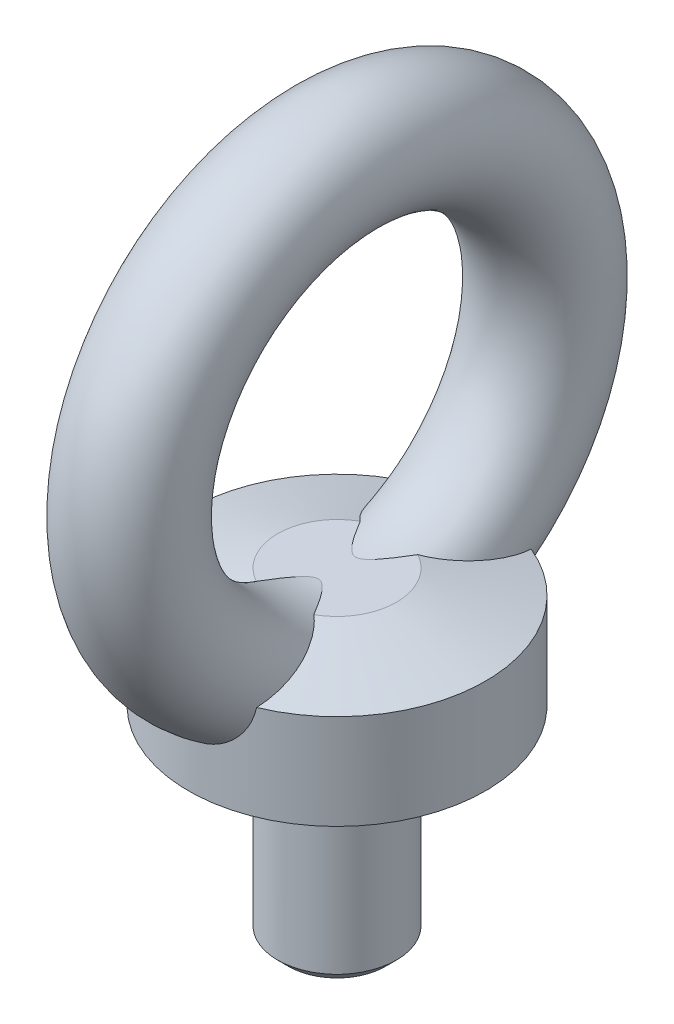
ISO-10303-21;
HEADER;
FILE_DESCRIPTION(('STEP AP214'),'2;1');
FILE_NAME('part.step','',(''),(''),'','','');
FILE_SCHEMA(('AUTOMOTIVE_DESIGN { 1 0 10303 214 1 1 1 1 }'));
ENDSEC;
DATA;
#1=APPLICATION_CONTEXT('core data for automotive mechanical design processes');
#2=APPLICATION_PROTOCOL_DEFINITION('international standard','automotive_design',2000,#1);
#3=PRODUCT_CONTEXT('',#1,'mechanical');
#4=PRODUCT('Part','Part','',(#3));
#5=PRODUCT_RELATED_PRODUCT_CATEGORY('part','',(#4));
#6=PRODUCT_DEFINITION_FORMATION('','',#4);
#7=PRODUCT_DEFINITION_CONTEXT('part definition',#1,'design');
#8=PRODUCT_DEFINITION('design','',#6,#7);
#9=PRODUCT_DEFINITION_SHAPE('','',#8);
#10=(LENGTH_UNIT() NAMED_UNIT(*) SI_UNIT(.MILLI.,.METRE.));
#11=(NAMED_UNIT(*) PLANE_ANGLE_UNIT() SI_UNIT($,.RADIAN.));
#12=(NAMED_UNIT(*) SI_UNIT($,.STERADIAN.) SOLID_ANGLE_UNIT());
#13=UNCERTAINTY_MEASURE_WITH_UNIT(LENGTH_MEASURE(1.E-05),#10,'distance_accuracy_value','');
#14=(GEOMETRIC_REPRESENTATION_CONTEXT(3) GLOBAL_UNCERTAINTY_ASSIGNED_CONTEXT((#13)) GLOBAL_UNIT_ASSIGNED_CONTEXT((#10,
#11,#12)) REPRESENTATION_CONTEXT('',''));
#15=CARTESIAN_POINT('',(0.,0.,0.));
#16=DIRECTION('',(0.,0.,1.));
#17=DIRECTION('',(1.,0.,0.));
#18=AXIS2_PLACEMENT_3D('',#15,#16,#17);
#19=CARTESIAN_POINT('',(2.04,-17.,0.));
#20=DIRECTION('',(0.,-1.,0.));
#21=DIRECTION('',(0.,0.,-1.));
#22=AXIS2_PLACEMENT_3D('',#19,#20,#21);
#23=PLANE('',#22);
#24=CARTESIAN_POINT('',(0.,-17.0000000004507,0.));
#25=DIRECTION('',(0.,1.,0.));
#26=DIRECTION('',(0.,0.,1.));
#27=AXIS2_PLACEMENT_3D('',#24,#25,#26);
#28=CIRCLE('',#27,4.08000000049924);
#29=CARTESIAN_POINT('',(0.,-17.0000000004507,4.08000000049924));
#30=VERTEX_POINT('',#29);
#31=EDGE_CURVE('E21',#30,#30,#28,.T.);
#32=ORIENTED_EDGE('',*,*,#31,.F.);
#33=EDGE_LOOP('',(#32));
#34=FACE_BOUND('',#33,.T.);
#35=ADVANCED_FACE('F16',(#34),#23,.T.);
#36=CARTESIAN_POINT('',(0.,-16.0799999997039,0.));
#37=DIRECTION('',(0.,1.,0.));
#38=DIRECTION('',(0.,0.,1.));
#39=AXIS2_PLACEMENT_3D('',#36,#37,#38);
#40=CONICAL_SURFACE('',#39,4.99999999959755,0.785398162501546);
#41=ORIENTED_EDGE('',*,*,#31,.T.);
#42=EDGE_LOOP('',(#41));
#43=FACE_BOUND('',#42,.T.);
#44=CARTESIAN_POINT('',(0.,-16.08,0.));
#45=DIRECTION('',(0.,-1.,0.));
#46=DIRECTION('',(1.,0.,0.));
#47=AXIS2_PLACEMENT_3D('',#44,#45,#46);
#48=CIRCLE('',#47,5.);
#49=CARTESIAN_POINT('',(5.,-16.08,0.));
#50=VERTEX_POINT('',#49);
#51=EDGE_CURVE('E248',#50,#50,#48,.F.);
#52=ORIENTED_EDGE('',*,*,#51,.F.);
#53=EDGE_LOOP('',(#52));
#54=FACE_BOUND('',#53,.T.);
#55=ADVANCED_FACE('F223',(#43,#54),#40,.T.);
#56=CARTESIAN_POINT('',(0.,-2.92,0.));
#57=DIRECTION('',(0.,-1.,0.));
#58=DIRECTION('',(0.,0.,-1.));
#59=AXIS2_PLACEMENT_3D('',#56,#57,#58);
#60=CYLINDRICAL_SURFACE('',#59,5.);
#61=ORIENTED_EDGE('',*,*,#51,.T.);
#62=EDGE_LOOP('',(#61));
#63=FACE_BOUND('',#62,.T.);
#64=CARTESIAN_POINT('',(0.,-2.92000000035842,0.));
#65=DIRECTION('',(0.,-1.,0.));
#66=DIRECTION('',(1.,0.,0.));
#67=AXIS2_PLACEMENT_3D('',#64,#65,#66);
#68=CIRCLE('',#67,4.99999999965439);
#69=CARTESIAN_POINT('',(4.99999999965439,-2.92000000035842,0.));
#70=VERTEX_POINT('',#69);
#71=EDGE_CURVE('E250',#70,#70,#68,.F.);
#72=ORIENTED_EDGE('',*,*,#71,.F.);
#73=EDGE_LOOP('',(#72));
#74=FACE_BOUND('',#73,.T.);
#75=ADVANCED_FACE('F215',(#63,#74),#60,.T.);
#76=CARTESIAN_POINT('',(0.,-2.92000000030157,0.));
#77=DIRECTION('',(0.,-1.,0.));
#78=DIRECTION('',(0.,0.,-1.));
#79=AXIS2_PLACEMENT_3D('',#76,#77,#78);
#80=CONICAL_SURFACE('',#79,4.99999999959755,0.785398162501546);
#81=ORIENTED_EDGE('',*,*,#71,.T.);
#82=EDGE_LOOP('',(#81));
#83=FACE_BOUND('',#82,.T.);
#84=CARTESIAN_POINT('',(0.,-2.,0.));
#85=DIRECTION('',(0.,-1.,0.));
#86=DIRECTION('',(1.,0.,0.));
#87=AXIS2_PLACEMENT_3D('',#84,#85,#86);
#88=CIRCLE('',#87,4.08);
#89=CARTESIAN_POINT('',(4.08,-2.,0.));
#90=VERTEX_POINT('',#89);
#91=EDGE_CURVE('E71',#90,#90,#88,.F.);
#92=ORIENTED_EDGE('',*,*,#91,.F.);
#93=EDGE_LOOP('',(#92));
#94=FACE_BOUND('',#93,.T.);
#95=ADVANCED_FACE('F142',(#83,#94),#80,.T.);
#96=CARTESIAN_POINT('',(2.5,10.,0.));
#97=DIRECTION('',(0.,1.,0.));
#98=DIRECTION('',(0.,0.,1.));
#99=AXIS2_PLACEMENT_3D('',#96,#97,#98);
#100=PLANE('',#99);
#101=CARTESIAN_POINT('',(2.42575801769206,10.,4.37215027699088));
#102=CARTESIAN_POINT('',(2.36769125095857,10.,4.27196090658997));
#103=CARTESIAN_POINT('',(2.30890407350442,10.,4.17218754427624));
#104=CARTESIAN_POINT('',(2.18980812570671,10.,3.97353737293334));
#105=CARTESIAN_POINT('',(2.12949917604716,10.,3.8746606714447));
#106=CARTESIAN_POINT('',(2.00735497814484,10.,3.67799251214498));
#107=CARTESIAN_POINT('',(1.94552135018494,10.,3.58020004987481));
#108=CARTESIAN_POINT('',(1.82011351808978,10.,3.38574590649166));
#109=CARTESIAN_POINT('',(1.75653940740595,10.,3.28908416506329));
#110=CARTESIAN_POINT('',(1.60738265325848,10.,3.06732612738618));
#111=CARTESIAN_POINT('',(1.52108701476958,10.,2.94270463473335));
#112=CARTESIAN_POINT('',(1.38820615837035,10.,2.75810985541741));
#113=CARTESIAN_POINT('',(1.34330514372148,10.,2.69692343650426));
#114=CARTESIAN_POINT('',(1.25213685752351,10.,2.57558141741107));
#115=CARTESIAN_POINT('',(1.20586971827811,10.,2.51542571829583));
#116=CARTESIAN_POINT('',(1.11759758439957,10.,2.4039895181083));
#117=CARTESIAN_POINT('',(1.07579451195056,10.,2.35254953221771));
#118=CARTESIAN_POINT('',(0.990566482703662,10.,2.25103368811579));
#119=CARTESIAN_POINT('',(0.94714173789767,10.,2.20095765307283));
#120=CARTESIAN_POINT('',(0.858252528230071,10.,2.10275234498235));
#121=CARTESIAN_POINT('',(0.812790723537028,10.,2.05462068058189));
#122=CARTESIAN_POINT('',(0.719116057106132,10.,1.96113629989081));
#123=CARTESIAN_POINT('',(0.670905361328063,10.,1.91578145251339));
#124=CARTESIAN_POINT('',(0.578387751822625,10.,1.83602241194328));
#125=CARTESIAN_POINT('',(0.534615624383027,10.,1.80100542845428));
#126=CARTESIAN_POINT('',(0.44353212182235,10.,1.73577650991707));
#127=CARTESIAN_POINT('',(0.396222652988164,10.,1.70556201384407));
#128=CARTESIAN_POINT('',(0.309924839315739,10.,1.65957913751122));
#129=CARTESIAN_POINT('',(0.271871624064532,10.,1.64209056123117));
#130=CARTESIAN_POINT('',(0.193524033088026,10.,1.61327271649259));
#131=CARTESIAN_POINT('',(0.153237895368909,10.,1.60192227862159));
#132=CARTESIAN_POINT('',(0.0937545270335424,10.,1.59113974384021));
#133=CARTESIAN_POINT('',(0.0751011575014408,10.,1.58858503451294));
#134=CARTESIAN_POINT('',(0.0376325361849512,10.,1.58516377317659));
#135=CARTESIAN_POINT('',(0.0188172546304149,10.,1.58429753858306));
#136=CARTESIAN_POINT('',(-0.0221623614077459,10.,1.58429843842034));
#137=CARTESIAN_POINT('',(-0.0443274597432195,10.,1.5855010847899));
#138=CARTESIAN_POINT('',(-0.088411681783047,10.,1.59023672371041));
#139=CARTESIAN_POINT('',(-0.110330638503873,10.,1.59377121127223));
#140=CARTESIAN_POINT('',(-0.175501362366195,10.,1.60762956003257));
#141=CARTESIAN_POINT('',(-0.218081304000072,10.,1.62120719590025));
#142=CARTESIAN_POINT('',(-0.288507447868656,10.,1.64990879410068));
#143=CARTESIAN_POINT('',(-0.317048082420653,10.,1.66344492301787));
#144=CARTESIAN_POINT('',(-0.372819881252884,10.,1.69302637522997));
#145=CARTESIAN_POINT('',(-0.400050148168097,10.,1.7090733869299));
#146=CARTESIAN_POINT('',(-0.453363480479852,10.,1.74313744926667));
#147=CARTESIAN_POINT('',(-0.479442224095819,10.,1.76116116095554));
#148=CARTESIAN_POINT('',(-0.530492453323873,10.,1.79868411553183));
#149=CARTESIAN_POINT('',(-0.555464313064664,10.,1.81818285373241));
#150=CARTESIAN_POINT('',(-0.636654973093528,10.,1.88467986633152));
#151=CARTESIAN_POINT('',(-0.690835007425611,10.,1.93415925561946));
#152=CARTESIAN_POINT('',(-0.79572263611098,10.,2.03678659999914));
#153=CARTESIAN_POINT('',(-0.846422299672276,10.,2.0899424135967));
#154=CARTESIAN_POINT('',(-0.945275222097797,10.,2.19866914685967));
#155=CARTESIAN_POINT('',(-0.993425506898962,10.,2.2542427552077));
#156=CARTESIAN_POINT('',(-1.08805420104545,10.,2.36738282067018));
#157=CARTESIAN_POINT('',(-1.1345200486371,10.,2.42495969365181));
#158=CARTESIAN_POINT('',(-1.2258233599275,10.,2.54125002756636));
#159=CARTESIAN_POINT('',(-1.27066310013928,10.,2.59996170799384));
#160=CARTESIAN_POINT('',(-1.35905997741818,10.,2.7183025796738));
#161=CARTESIAN_POINT('',(-1.40261762793686,10.,2.77793138865708));
#162=CARTESIAN_POINT('',(-1.49041139248882,10.,2.9003722250232));
#163=CARTESIAN_POINT('',(-1.53460381099604,10.,2.96321552353818));
#164=CARTESIAN_POINT('',(-1.62201825481142,10.,3.08960714648303));
#165=CARTESIAN_POINT('',(-1.66523990948712,10.,3.15315572680145));
#166=CARTESIAN_POINT('',(-1.75082224472706,10.,3.2808581658622));
#167=CARTESIAN_POINT('',(-1.79318265177828,10.,3.34501220769954));
#168=CARTESIAN_POINT('',(-1.87711642901371,10.,3.47384916023144));
#169=CARTESIAN_POINT('',(-1.91868965576139,10.,3.53853216429431));
#170=CARTESIAN_POINT('',(-2.0000576764584,10.,3.66672774156038));
#171=CARTESIAN_POINT('',(-2.03987087242252,10.,3.73022864251709));
#172=CARTESIAN_POINT('',(-2.11882465582035,10.,3.8576302704549));
#173=CARTESIAN_POINT('',(-2.1579653703923,10.,3.92153091867368));
#174=CARTESIAN_POINT('',(-2.23559056372076,10.,4.04969213598231));
#175=CARTESIAN_POINT('',(-2.27407531560362,10.,4.11395253970163));
#176=CARTESIAN_POINT('',(-2.35039409999607,10.,4.24280005611512));
#177=CARTESIAN_POINT('',(-2.38822855420701,10.,4.30738691900181));
#178=CARTESIAN_POINT('',(-2.42575801769205,10.,4.37215027699086));
#179=B_SPLINE_CURVE_WITH_KNOTS('',3,(#101,#102,#103,#104,#105,#106,#107,#108,#109,#110,#111,
#112,#113,#114,#115,#116,#117,#118,#119,#120,#121,#122,#123,#124,#125,#126,#127,#128,#129,#130,
#131,#132,#133,#134,#135,#136,#137,#138,#139,#140,#141,#142,#143,#144,#145,#146,#147,#148,#149,
#150,#151,#152,#153,#154,#155,#156,#157,#158,#159,#160,#161,#162,#163,#164,#165,#166,#167,#168,
#169,#170,#171,#172,#173,#174,#175,#176,#177,#178),.UNSPECIFIED.,.F.,.F.,(4,2,2,2,2,2,2,2,2,2,2,
2,2,2,2,2,2,2,2,2,2,2,2,2,2,2,2,2,2,2,2,2,2,2,2,2,2,2,4),(0.,0.347399010272284,
0.694839148785381,1.04192474818436,1.38899174798338,1.84365306851952,2.07132086582964,
2.29896668627749,2.4977937572751,2.69659492711869,2.8951436486657,3.09353803158327,
3.26151414557359,3.42940038013114,3.55468117621655,3.67952709870166,3.73594395922499,
3.79237142450411,3.85882989059816,3.92533100659837,4.05858548321878,4.15323125791571,
4.24794095142284,4.34298021694072,4.43798711016742,4.6577803472211,4.87805885828478,
5.09858892312364,5.32051972131764,5.54212678017692,5.76364384774179,5.99411117139981,
6.22466503982526,6.45529101806273,6.68595862321313,6.91080339383865,7.13560517724013,
7.36031095217893,7.5848650505717),.UNSPECIFIED.);
#180=CARTESIAN_POINT('',(2.42575801793015,10.0000000028071,4.37215027742957));
#181=VERTEX_POINT('',#180);
#182=CARTESIAN_POINT('',(-2.42575801575232,10.0000000052661,4.37215028070146));
#183=VERTEX_POINT('',#182);
#184=EDGE_CURVE('E56',#181,#183,#179,.T.);
#185=ORIENTED_EDGE('',*,*,#184,.F.);
#186=CARTESIAN_POINT('',(0.,10.0000000056142,0.));
#187=DIRECTION('',(0.,-1.,0.));
#188=DIRECTION('',(0.,0.,-1.));
#189=AXIS2_PLACEMENT_3D('',#186,#187,#188);
#190=CIRCLE('',#189,5.00000000149712);
#191=CARTESIAN_POINT('',(2.4257580157523,10.0000000052661,-4.37215028070147));
#192=VERTEX_POINT('',#191);
#193=EDGE_CURVE('E70',#192,#181,#190,.T.);
#194=ORIENTED_EDGE('',*,*,#193,.F.);
#195=CARTESIAN_POINT('',(-2.42575801769206,10.,-4.37215027699087));
#196=CARTESIAN_POINT('',(-2.36769125095857,10.,-4.27196090658997));
#197=CARTESIAN_POINT('',(-2.30890407350442,10.,-4.17218754427624));
#198=CARTESIAN_POINT('',(-2.18980812570671,10.,-3.97353737293334));
#199=CARTESIAN_POINT('',(-2.12949917604716,10.,-3.8746606714447));
#200=CARTESIAN_POINT('',(-2.00735497814484,10.,-3.67799251214498));
#201=CARTESIAN_POINT('',(-1.94552135018495,10.,-3.58020004987481));
#202=CARTESIAN_POINT('',(-1.82011351808978,10.,-3.38574590649166));
#203=CARTESIAN_POINT('',(-1.75653940740595,10.,-3.28908416506329));
#204=CARTESIAN_POINT('',(-1.60738265325848,10.,-3.06732612738617));
#205=CARTESIAN_POINT('',(-1.52108701476959,10.,-2.94270463473335));
#206=CARTESIAN_POINT('',(-1.38820615837034,10.,-2.7581098554174));
#207=CARTESIAN_POINT('',(-1.34330514372147,10.,-2.69692343650425));
#208=CARTESIAN_POINT('',(-1.2521368575235,10.,-2.57558141741106));
#209=CARTESIAN_POINT('',(-1.20586971827811,10.,-2.51542571829582));
#210=CARTESIAN_POINT('',(-1.11759758439957,10.,-2.40398951810828));
#211=CARTESIAN_POINT('',(-1.07579451195055,10.,-2.35254953221769));
#212=CARTESIAN_POINT('',(-0.990566482703652,10.,-2.25103368811576));
#213=CARTESIAN_POINT('',(-0.947141737897658,10.,-2.20095765307281));
#214=CARTESIAN_POINT('',(-0.858252528230053,10.,-2.10275234498233));
#215=CARTESIAN_POINT('',(-0.812790723537007,10.,-2.05462068058186));
#216=CARTESIAN_POINT('',(-0.719116057106104,10.,-1.96113629989078));
#217=CARTESIAN_POINT('',(-0.670905361328031,10.,-1.91578145251336));
#218=CARTESIAN_POINT('',(-0.578387751822588,10.,-1.83602241194325));
#219=CARTESIAN_POINT('',(-0.534615624382988,10.,-1.80100542845426));
#220=CARTESIAN_POINT('',(-0.443532121822317,10.,-1.73577650991704));
#221=CARTESIAN_POINT('',(-0.39622265298814,10.,-1.70556201384403));
#222=CARTESIAN_POINT('',(-0.30992483931571,10.,-1.6595791375112));
#223=CARTESIAN_POINT('',(-0.271871624064494,10.,-1.64209056123118));
#224=CARTESIAN_POINT('',(-0.193524033087987,10.,-1.6132727164926));
#225=CARTESIAN_POINT('',(-0.153237895368875,10.,-1.60192227862159));
#226=CARTESIAN_POINT('',(-0.0937545270335168,10.,-1.5911397438402));
#227=CARTESIAN_POINT('',(-0.0751011575014206,10.,-1.58858503451294));
#228=CARTESIAN_POINT('',(-0.0376325361849423,10.,-1.58516377317659));
#229=CARTESIAN_POINT('',(-0.0188172546304121,10.,-1.58429753858306));
#230=CARTESIAN_POINT('',(0.0221623614077426,10.,-1.58429843842035));
#231=CARTESIAN_POINT('',(0.0443274597432162,10.,-1.5855010847899));
#232=CARTESIAN_POINT('',(0.0884116817830438,10.,-1.59023672371042));
#233=CARTESIAN_POINT('',(0.11033063850387,10.,-1.59377121127223));
#234=CARTESIAN_POINT('',(0.175501362366191,10.,-1.60762956003257));
#235=CARTESIAN_POINT('',(0.218081304000067,10.,-1.62120719590025));
#236=CARTESIAN_POINT('',(0.288507447868655,10.,-1.64990879410067));
#237=CARTESIAN_POINT('',(0.317048082420657,10.,-1.66344492301785));
#238=CARTESIAN_POINT('',(0.372819881252885,10.,-1.69302637522996));
#239=CARTESIAN_POINT('',(0.400050148168093,10.,-1.70907338692989));
#240=CARTESIAN_POINT('',(0.453363480479845,10.,-1.74313744926667));
#241=CARTESIAN_POINT('',(0.479442224095816,10.,-1.76116116095553));
#242=CARTESIAN_POINT('',(0.530492453323868,10.,-1.79868411553183));
#243=CARTESIAN_POINT('',(0.555464313064653,10.,-1.81818285373242));
#244=CARTESIAN_POINT('',(0.636654973093506,10.,-1.88467986633153));
#245=CARTESIAN_POINT('',(0.690835007425599,10.,-1.93415925561946));
#246=CARTESIAN_POINT('',(0.795722636110974,10.,-2.03678659999913));
#247=CARTESIAN_POINT('',(0.846422299672264,10.,-2.08994241359669));
#248=CARTESIAN_POINT('',(0.945275222097779,10.,-2.19866914685966));
#249=CARTESIAN_POINT('',(0.993425506898945,10.,-2.25424275520768));
#250=CARTESIAN_POINT('',(1.08805420104543,10.,-2.36738282067015));
#251=CARTESIAN_POINT('',(1.13452004863708,10.,-2.42495969365177));
#252=CARTESIAN_POINT('',(1.22582335992748,10.,-2.54125002756631));
#253=CARTESIAN_POINT('',(1.27066310013924,10.,-2.5999617079938));
#254=CARTESIAN_POINT('',(1.35905997741814,10.,-2.71830257967375));
#255=CARTESIAN_POINT('',(1.40261762793682,10.,-2.77793138865702));
#256=CARTESIAN_POINT('',(1.49041139248878,10.,-2.90037222502314));
#257=CARTESIAN_POINT('',(1.534603810996,10.,-2.96321552353812));
#258=CARTESIAN_POINT('',(1.62201825481138,10.,-3.08960714648297));
#259=CARTESIAN_POINT('',(1.66523990948708,10.,-3.1531557268014));
#260=CARTESIAN_POINT('',(1.75082224472702,10.,-3.28085816586215));
#261=CARTESIAN_POINT('',(1.79318265177825,10.,-3.34501220769949));
#262=CARTESIAN_POINT('',(1.87711642901368,10.,-3.47384916023139));
#263=CARTESIAN_POINT('',(1.91868965576136,10.,-3.53853216429427));
#264=CARTESIAN_POINT('',(2.00005767645837,10.,-3.66672774156035));
#265=CARTESIAN_POINT('',(2.03987087242249,10.,-3.73022864251705));
#266=CARTESIAN_POINT('',(2.11882465582034,10.,-3.85763027045487));
#267=CARTESIAN_POINT('',(2.15796537039229,10.,-3.92153091867365));
#268=CARTESIAN_POINT('',(2.23559056372075,10.,-4.04969213598229));
#269=CARTESIAN_POINT('',(2.27407531560361,10.,-4.11395253970162));
#270=CARTESIAN_POINT('',(2.35039409999606,10.,-4.24280005611512));
#271=CARTESIAN_POINT('',(2.38822855420701,10.,-4.30738691900181));
#272=CARTESIAN_POINT('',(2.42575801769206,10.,-4.37215027699087));
#273=B_SPLINE_CURVE_WITH_KNOTS('',3,(#195,#196,#197,#198,#199,#200,#201,#202,#203,#204,#205,
#206,#207,#208,#209,#210,#211,#212,#213,#214,#215,#216,#217,#218,#219,#220,#221,#222,#223,#224,
#225,#226,#227,#228,#229,#230,#231,#232,#233,#234,#235,#236,#237,#238,#239,#240,#241,#242,#243,
#244,#245,#246,#247,#248,#249,#250,#251,#252,#253,#254,#255,#256,#257,#258,#259,#260,#261,#262,
#263,#264,#265,#266,#267,#268,#269,#270,#271,#272),.UNSPECIFIED.,.F.,.F.,(4,2,2,2,2,2,2,2,2,2,2,
2,2,2,2,2,2,2,2,2,2,2,2,2,2,2,2,2,2,2,2,2,2,2,2,2,2,2,4),(0.,0.34739901027228,0.694839148785373,
1.04192474818435,1.38899174798337,1.84365306851952,2.07132086582964,2.29896668627749,
2.49779375727511,2.69659492711871,2.89514364866573,3.09353803158331,3.26151414557363,
3.42940038013117,3.55468117621658,3.67952709870168,3.735943959225,3.7923714245041,
3.85882989059815,3.92533100659836,4.05858548321877,4.1532312579157,4.24794095142283,
4.34298021694071,4.43798711016741,4.65778034722108,4.87805885828476,5.09858892312361,
5.32051972131758,5.54212678017685,5.7636438477417,5.99411117139974,6.22466503982519,
6.45529101806266,6.68595862321307,6.91080339383861,7.1356051772401,7.36031095217892,
7.5848650505717),.UNSPECIFIED.);
#274=CARTESIAN_POINT('',(-2.42575801793014,10.0000000028071,-4.37215027742957));
#275=VERTEX_POINT('',#274);
#276=EDGE_CURVE('E73',#275,#192,#273,.T.);
#277=ORIENTED_EDGE('',*,*,#276,.F.);
#278=CARTESIAN_POINT('',(0.,10.0000000056142,0.));
#279=DIRECTION('',(0.,-1.,0.));
#280=DIRECTION('',(0.,0.,-1.));
#281=AXIS2_PLACEMENT_3D('',#278,#279,#280);
#282=CIRCLE('',#281,5.00000000149711);
#283=EDGE_CURVE('E61',#183,#275,#282,.T.);
#284=ORIENTED_EDGE('',*,*,#283,.F.);
#285=EDGE_LOOP('',(#185,#194,#277,#284));
#286=FACE_BOUND('',#285,.T.);
#287=ADVANCED_FACE('F74',(#286),#100,.T.);
#288=CARTESIAN_POINT('',(0.,0.,0.));
#289=DIRECTION('',(0.,-1.,0.));
#290=DIRECTION('',(0.,0.,-1.));
#291=AXIS2_PLACEMENT_3D('',#288,#289,#290);
#292=CYLINDRICAL_SURFACE('',#291,4.08);
#293=ORIENTED_EDGE('',*,*,#91,.T.);
#294=EDGE_LOOP('',(#293));
#295=FACE_BOUND('',#294,.T.);
#296=CARTESIAN_POINT('',(0.,0.,0.));
#297=DIRECTION('',(0.,-1.,0.));
#298=DIRECTION('',(0.,0.,-1.));
#299=AXIS2_PLACEMENT_3D('',#296,#297,#298);
#300=CIRCLE('',#299,4.08);
#301=CARTESIAN_POINT('',(0.,0.,-4.08));
#302=VERTEX_POINT('',#301);
#303=EDGE_CURVE('E117',#302,#302,#300,.F.);
#304=ORIENTED_EDGE('',*,*,#303,.F.);
#305=EDGE_LOOP('',(#304));
#306=FACE_BOUND('',#305,.T.);
#307=ADVANCED_FACE('F141',(#295,#306),#292,.T.);
#308=CARTESIAN_POINT('',(0.,7.99999999438584,0.));
#309=DIRECTION('',(0.,-1.,0.));
#310=DIRECTION('',(0.,0.,-1.));
#311=AXIS2_PLACEMENT_3D('',#308,#309,#310);
#312=CONICAL_SURFACE('',#311,12.4999999985029,1.31019393355045);
#313=CARTESIAN_POINT('',(0.,8.,0.));
#314=DIRECTION('',(0.,-1.,0.));
#315=DIRECTION('',(1.,0.,0.));
#316=AXIS2_PLACEMENT_3D('',#313,#314,#315);
#317=CIRCLE('',#316,12.5);
#318=CARTESIAN_POINT('',(-4.78935148739898,7.9999999972054,11.5460864499737));
#319=VERTEX_POINT('',#318);
#320=CARTESIAN_POINT('',(-4.78935148730205,7.99999999666433,-11.5460864500139));
#321=VERTEX_POINT('',#320);
#322=EDGE_CURVE('E115',#319,#321,#317,.T.);
#323=ORIENTED_EDGE('',*,*,#322,.F.);
#324=CARTESIAN_POINT('',(-2.42575801333639,10.000000004918,4.37215028353464));
#325=CARTESIAN_POINT('',(-2.50516221593232,9.97465305055177,4.43675765203616));
#326=CARTESIAN_POINT('',(-2.58222090033602,9.94889336480226,4.50401594700249));
#327=CARTESIAN_POINT('',(-2.73164501049944,9.89683308028156,4.64300751964826));
#328=CARTESIAN_POINT('',(-2.80402109381967,9.87053390316706,4.71472984997029));
#329=CARTESIAN_POINT('',(-2.944407737005,9.81757374553181,4.86208845033807));
#330=CARTESIAN_POINT('',(-3.01242097669113,9.79091299953247,4.93772226521823));
#331=CARTESIAN_POINT('',(-3.14401220879969,9.73748317507697,5.09204648064309));
#332=CARTESIAN_POINT('',(-3.20760973444092,9.7107152127658,5.17072065557618));
#333=CARTESIAN_POINT('',(-3.33093942672552,9.65703304507181,5.33107118659948));
#334=CARTESIAN_POINT('',(-3.39066915693208,9.630118758865,5.41274938518828));
#335=CARTESIAN_POINT('',(-3.50639733504226,9.57622452671372,5.57872776770278));
#336=CARTESIAN_POINT('',(-3.56239433132502,9.54924455940565,5.66302895320232));
#337=CARTESIAN_POINT('',(-3.70033381756156,9.4805611162274,5.88054362457411));
#338=CARTESIAN_POINT('',(-3.7797671409603,9.4388541480524,6.0153539889032));
#339=CARTESIAN_POINT('',(-3.93035388274995,9.35557022626104,6.28955644478828));
#340=CARTESIAN_POINT('',(-4.00150636447931,9.31399328786918,6.42894905236792));
#341=CARTESIAN_POINT('',(-4.13575422450745,9.23105714018137,6.71162965904613));
#342=CARTESIAN_POINT('',(-4.19884913882147,9.18969794355517,6.85491788189303));
#343=CARTESIAN_POINT('',(-4.31741212514975,9.10703524697689,7.14562762259208));
#344=CARTESIAN_POINT('',(-4.37283550609368,9.06573335608117,7.2930677940138));
#345=CARTESIAN_POINT('',(-4.47563711329327,8.98347740078255,7.59080521137397));
#346=CARTESIAN_POINT('',(-4.52301603461999,8.94252330661952,7.74110220922298));
#347=CARTESIAN_POINT('',(-4.60966542006502,8.8610021475879,8.04415222399266));
#348=CARTESIAN_POINT('',(-4.64893419832294,8.82043516485661,8.19690574445347));
#349=CARTESIAN_POINT('',(-4.72394798290921,8.73430167180084,8.5251732851612));
#350=CARTESIAN_POINT('',(-4.75850281294858,8.68879905024637,8.70097761769364));
#351=CARTESIAN_POINT('',(-4.81666309493828,8.59844815171557,9.05455629938336));
#352=CARTESIAN_POINT('',(-4.84026853766905,8.55359987529024,9.2323306501993));
#353=CARTESIAN_POINT('',(-4.87614701977862,8.46465810049468,9.58916213523687));
#354=CARTESIAN_POINT('',(-4.88842322387364,8.42056439472211,9.76821889713612));
#355=CARTESIAN_POINT('',(-4.90115824300755,8.33361596713049,10.125344323132));
#356=CARTESIAN_POINT('',(-4.90172276344387,8.2907536529029,10.3034073101956));
#357=CARTESIAN_POINT('',(-4.8908331583315,8.20596000113078,10.6594550769167));
#358=CARTESIAN_POINT('',(-4.87937581147038,8.16402891618836,10.8374398228215));
#359=CARTESIAN_POINT('',(-4.84391592534507,8.08119433402669,11.1926277436644));
#360=CARTESIAN_POINT('',(-4.81989759928461,8.04029219796063,11.3698296514469));
#361=CARTESIAN_POINT('',(-4.78935148702119,7.9999999944108,11.5460864492693));
#362=B_SPLINE_CURVE_WITH_KNOTS('',3,(#324,#325,#326,#327,#328,#329,#330,#331,#332,#333,#334,
#335,#336,#337,#338,#339,#340,#341,#342,#343,#344,#345,#346,#347,#348,#349,#350,#351,#352,#353,
#354,#355,#356,#357,#358,#359,#360,#361),.UNSPECIFIED.,.F.,.F.,(4,2,2,2,2,2,2,2,2,2,2,2,2,2,2,2,
2,2,4),(0.,0.316254779640744,0.631762419580191,0.947074369674953,1.26088855946153,
1.57489854459735,1.88902994095312,2.37451459027184,2.86005410040934,3.34562155712652,
3.83390831378299,4.32215285916447,4.81049879431222,5.36472971551487,5.91896110338728,
6.47303762503198,7.02211105611003,7.57133165141984,8.12124417882887),.UNSPECIFIED.);
#363=EDGE_CURVE('E68',#183,#319,#362,.T.);
#364=ORIENTED_EDGE('',*,*,#363,.F.);
#365=ORIENTED_EDGE('',*,*,#283,.T.);
#366=CARTESIAN_POINT('',(-4.78935148702119,7.99999999441079,-11.5460864492693));
#367=CARTESIAN_POINT('',(-4.82395836517893,8.04565261839108,-11.3463783115432));
#368=CARTESIAN_POINT('',(-4.85018791438981,8.09208536745247,-11.1454725819592));
#369=CARTESIAN_POINT('',(-4.88660381606436,8.18628265925222,-10.7426649707016));
#370=CARTESIAN_POINT('',(-4.89680167260344,8.23404622194941,-10.5407639077232));
#371=CARTESIAN_POINT('',(-4.90190633646476,8.33061197688046,-10.1376204468501));
#372=CARTESIAN_POINT('',(-4.89685444215214,8.37941100922374,-9.93637774488605));
#373=CARTESIAN_POINT('',(-4.87220682227135,8.47802711316333,-9.5349998341642));
#374=CARTESIAN_POINT('',(-4.85260760460142,8.52784442640636,-9.33486490295147));
#375=CARTESIAN_POINT('',(-4.79596030281832,8.63493701397832,-8.91060173120064));
#376=CARTESIAN_POINT('',(-4.75696334206365,8.69233463087988,-8.68676353737732));
#377=CARTESIAN_POINT('',(-4.6617778985977,8.8080832292866,-8.24300964942504));
#378=CARTESIAN_POINT('',(-4.60558751794174,8.86643431536969,-8.02309439117826));
#379=CARTESIAN_POINT('',(-4.47626917660219,8.98410633977414,-7.58781677257897));
#380=CARTESIAN_POINT('',(-4.40309198300209,9.04342962215717,-7.37246967119548));
#381=CARTESIAN_POINT('',(-4.24004306283896,9.16271386833597,-6.94840570387638));
#382=CARTESIAN_POINT('',(-4.15017542826694,9.22267467244101,-6.73968722745848));
#383=CARTESIAN_POINT('',(-3.97367070932006,9.33068250965775,-6.37255959355779));
#384=CARTESIAN_POINT('',(-3.89015896444964,9.37864789624546,-6.21261988244629));
#385=CARTESIAN_POINT('',(-3.71200697039752,9.47473373095431,-5.89902303591572));
#386=CARTESIAN_POINT('',(-3.61736437689421,9.52285420965706,-5.74536723319799));
#387=CARTESIAN_POINT('',(-3.41686648535708,9.61875216309732,-5.44663553446599));
#388=CARTESIAN_POINT('',(-3.31107143218656,9.66653012816412,-5.30151953342493));
#389=CARTESIAN_POINT('',(-3.08705746814478,9.76155731911784,-5.02112581780732));
#390=CARTESIAN_POINT('',(-2.96885017536434,9.80880699444687,-4.8858391000605));
#391=CARTESIAN_POINT('',(-2.77811502238872,9.87997179992452,-4.68894305955794));
#392=CARTESIAN_POINT('',(-2.7104484508548,9.90434617948247,-4.62276934986556));
#393=CARTESIAN_POINT('',(-2.57112065703365,9.95259988266635,-4.4943494304605));
#394=CARTESIAN_POINT('',(-2.49945347827622,9.97647839133921,-4.43210938806033));
#395=CARTESIAN_POINT('',(-2.4257580133364,10.000000004918,-4.37215028353464));
#396=B_SPLINE_CURVE_WITH_KNOTS('',3,(#366,#367,#368,#369,#370,#371,#372,#373,#374,#375,#376,
#377,#378,#379,#380,#381,#382,#383,#384,#385,#386,#387,#388,#389,#390,#391,#392,#393,#394,#395),
.UNSPECIFIED.,.F.,.F.,(4,2,2,2,2,2,2,2,2,2,2,2,2,2,4),(0.,0.623007469840805,1.24556767550912,
1.86644341880856,2.48746825226955,3.18981795444796,3.89224521548872,4.59673431860266,
5.30105092976864,5.86075414006142,6.42057544395962,6.9775141607061,7.53393614238907,
7.8269917787425,8.12049602661354),.UNSPECIFIED.);
#397=EDGE_CURVE('E66',#321,#275,#396,.T.);
#398=ORIENTED_EDGE('',*,*,#397,.F.);
#399=EDGE_LOOP('',(#323,#364,#365,#398));
#400=FACE_BOUND('',#399,.T.);
#401=ADVANCED_FACE('F64',(#400),#312,.T.);
#402=CARTESIAN_POINT('',(0.,7.99999999438584,0.));
#403=DIRECTION('',(0.,-1.,0.));
#404=DIRECTION('',(0.,0.,-1.));
#405=AXIS2_PLACEMENT_3D('',#402,#403,#404);
#406=CONICAL_SURFACE('',#405,12.4999999985029,1.31019393355045);
#407=ORIENTED_EDGE('',*,*,#193,.T.);
#408=CARTESIAN_POINT('',(4.78935148702119,7.9999999944108,11.5460864492693));
#409=CARTESIAN_POINT('',(4.82395836517893,8.04565261839108,11.3463783115432));
#410=CARTESIAN_POINT('',(4.85018791438981,8.09208536745247,11.1454725819592));
#411=CARTESIAN_POINT('',(4.88660381606436,8.18628265925222,10.7426649707016));
#412=CARTESIAN_POINT('',(4.89680167260344,8.23404622194941,10.5407639077232));
#413=CARTESIAN_POINT('',(4.90190633646476,8.33061197688045,10.1376204468501));
#414=CARTESIAN_POINT('',(4.89685444215214,8.37941100922374,9.93637774488605));
#415=CARTESIAN_POINT('',(4.87220682227135,8.47802711316333,9.53499983416421));
#416=CARTESIAN_POINT('',(4.85260760460142,8.52784442640636,9.33486490295147));
#417=CARTESIAN_POINT('',(4.79596030281832,8.63493701397832,8.91060173120064));
#418=CARTESIAN_POINT('',(4.75696334206365,8.69233463087988,8.68676353737731));
#419=CARTESIAN_POINT('',(4.6617778985977,8.8080832292866,8.24300964942504));
#420=CARTESIAN_POINT('',(4.60558751794174,8.86643431536969,8.02309439117825));
#421=CARTESIAN_POINT('',(4.47626917660219,8.98410633977414,7.58781677257897));
#422=CARTESIAN_POINT('',(4.40309198300209,9.04342962215717,7.37246967119547));
#423=CARTESIAN_POINT('',(4.24004306283895,9.16271386833597,6.94840570387638));
#424=CARTESIAN_POINT('',(4.15017542826694,9.22267467244101,6.73968722745847));
#425=CARTESIAN_POINT('',(3.97367070932006,9.33068250965775,6.37255959355778));
#426=CARTESIAN_POINT('',(3.89015896444963,9.37864789624546,6.21261988244628));
#427=CARTESIAN_POINT('',(3.71200697039752,9.47473373095431,5.89902303591571));
#428=CARTESIAN_POINT('',(3.6173643768942,9.52285420965706,5.74536723319798));
#429=CARTESIAN_POINT('',(3.41686648535708,9.61875216309732,5.44663553446599));
#430=CARTESIAN_POINT('',(3.31107143218656,9.66653012816412,5.30151953342493));
#431=CARTESIAN_POINT('',(3.08705746814477,9.76155731911784,5.02112581780732));
#432=CARTESIAN_POINT('',(2.96885017536434,9.80880699444687,4.8858391000605));
#433=CARTESIAN_POINT('',(2.77811502238872,9.87997179992452,4.68894305955794));
#434=CARTESIAN_POINT('',(2.7104484508548,9.90434617948247,4.62276934986556));
#435=CARTESIAN_POINT('',(2.57112065703365,9.95259988266635,4.49434943046049));
#436=CARTESIAN_POINT('',(2.49945347827621,9.97647839133921,4.43210938806033));
#437=CARTESIAN_POINT('',(2.42575801333639,10.000000004918,4.37215028353464));
#438=B_SPLINE_CURVE_WITH_KNOTS('',3,(#408,#409,#410,#411,#412,#413,#414,#415,#416,#417,#418,
#419,#420,#421,#422,#423,#424,#425,#426,#427,#428,#429,#430,#431,#432,#433,#434,#435,#436,#437),
.UNSPECIFIED.,.F.,.F.,(4,2,2,2,2,2,2,2,2,2,2,2,2,2,4),(0.,0.623007469840809,1.24556767550913,
1.86644341880858,2.48746825226957,3.18981795444798,3.89224521548874,4.59673431860269,
5.30105092976867,5.86075414006145,6.42057544395964,6.97751416070612,7.53393614238909,
7.82699177874252,8.12049602661356),.UNSPECIFIED.);
#439=CARTESIAN_POINT('',(4.78935148730205,7.99999999666433,11.5460864500139));
#440=VERTEX_POINT('',#439);
#441=EDGE_CURVE('E36',#440,#181,#438,.T.);
#442=ORIENTED_EDGE('',*,*,#441,.F.);
#443=CARTESIAN_POINT('',(0.,8.,0.));
#444=DIRECTION('',(0.,-1.,0.));
#445=DIRECTION('',(1.,0.,0.));
#446=AXIS2_PLACEMENT_3D('',#443,#444,#445);
#447=CIRCLE('',#446,12.5);
#448=CARTESIAN_POINT('',(4.78935148739897,7.99999999720539,-11.5460864499737));
#449=VERTEX_POINT('',#448);
#450=EDGE_CURVE('E118',#449,#440,#447,.T.);
#451=ORIENTED_EDGE('',*,*,#450,.F.);
#452=CARTESIAN_POINT('',(2.42575801333639,10.000000004918,-4.37215028353464));
#453=CARTESIAN_POINT('',(2.50516221593232,9.97465305055177,-4.43675765203616));
#454=CARTESIAN_POINT('',(2.58222090033602,9.94889336480226,-4.5040159470025));
#455=CARTESIAN_POINT('',(2.73164501049945,9.89683308028156,-4.64300751964826));
#456=CARTESIAN_POINT('',(2.80402109381967,9.87053390316706,-4.71472984997029));
#457=CARTESIAN_POINT('',(2.944407737005,9.81757374553181,-4.86208845033807));
#458=CARTESIAN_POINT('',(3.01242097669114,9.79091299953247,-4.93772226521823));
#459=CARTESIAN_POINT('',(3.14401220879969,9.73748317507697,-5.0920464806431));
#460=CARTESIAN_POINT('',(3.20760973444092,9.7107152127658,-5.17072065557618));
#461=CARTESIAN_POINT('',(3.33093942672552,9.65703304507181,-5.33107118659948));
#462=CARTESIAN_POINT('',(3.39066915693208,9.630118758865,-5.41274938518829));
#463=CARTESIAN_POINT('',(3.50639733504227,9.57622452671372,-5.57872776770278));
#464=CARTESIAN_POINT('',(3.56239433132502,9.54924455940565,-5.66302895320232));
#465=CARTESIAN_POINT('',(3.70033381756156,9.48056111622738,-5.88054362457411));
#466=CARTESIAN_POINT('',(3.7797671409603,9.4388541480524,-6.0153539889032));
#467=CARTESIAN_POINT('',(3.93035388274995,9.35557022626104,-6.28955644478828));
#468=CARTESIAN_POINT('',(4.00150636447931,9.31399328786918,-6.42894905236792));
#469=CARTESIAN_POINT('',(4.13575422450745,9.23105714018137,-6.71162965904613));
#470=CARTESIAN_POINT('',(4.19884913882147,9.18969794355517,-6.85491788189303));
#471=CARTESIAN_POINT('',(4.31741212514975,9.10703524697689,-7.14562762259208));
#472=CARTESIAN_POINT('',(4.37283550609368,9.06573335608117,-7.29306779401381));
#473=CARTESIAN_POINT('',(4.47563711329327,8.98347740078255,-7.59080521137397));
#474=CARTESIAN_POINT('',(4.52301603461999,8.94252330661952,-7.74110220922298));
#475=CARTESIAN_POINT('',(4.60966542006502,8.8610021475879,-8.04415222399266));
#476=CARTESIAN_POINT('',(4.64893419832294,8.82043516485661,-8.19690574445347));
#477=CARTESIAN_POINT('',(4.72394798290921,8.73430167180085,-8.5251732851612));
#478=CARTESIAN_POINT('',(4.75850281294858,8.68879905024637,-8.70097761769364));
#479=CARTESIAN_POINT('',(4.81666309493828,8.59844815171557,-9.05455629938336));
#480=CARTESIAN_POINT('',(4.84026853766905,8.55359987529024,-9.23233065019929));
#481=CARTESIAN_POINT('',(4.87614701977862,8.46465810049468,-9.58916213523686));
#482=CARTESIAN_POINT('',(4.88842322387364,8.42056439472212,-9.76821889713612));
#483=CARTESIAN_POINT('',(4.90115824300755,8.3336159671305,-10.125344323132));
#484=CARTESIAN_POINT('',(4.90172276344387,8.29075365290291,-10.3034073101956));
#485=CARTESIAN_POINT('',(4.8908331583315,8.20596000113079,-10.6594550769167));
#486=CARTESIAN_POINT('',(4.87937581147038,8.16402891618836,-10.8374398228215));
#487=CARTESIAN_POINT('',(4.84391592534507,8.08119433402669,-11.1926277436644));
#488=CARTESIAN_POINT('',(4.81989759928461,8.04029219796063,-11.3698296514468));
#489=CARTESIAN_POINT('',(4.78935148702119,7.99999999441078,-11.5460864492693));
#490=B_SPLINE_CURVE_WITH_KNOTS('',3,(#452,#453,#454,#455,#456,#457,#458,#459,#460,#461,#462,
#463,#464,#465,#466,#467,#468,#469,#470,#471,#472,#473,#474,#475,#476,#477,#478,#479,#480,#481,
#482,#483,#484,#485,#486,#487,#488,#489),.UNSPECIFIED.,.F.,.F.,(4,2,2,2,2,2,2,2,2,2,2,2,2,2,2,2,
2,2,4),(0.,0.316254779640743,0.631762419580191,0.947074369674952,1.26088855946152,
1.57489854459735,1.88902994095312,2.37451459027184,2.86005410040934,3.34562155712652,
3.83390831378298,4.32215285916447,4.81049879431221,5.36472971551486,5.91896110338727,
6.47303762503197,7.02211105611002,7.57133165141982,8.12124417882885),.UNSPECIFIED.);
#491=EDGE_CURVE('E82',#192,#449,#490,.T.);
#492=ORIENTED_EDGE('',*,*,#491,.F.);
#493=EDGE_LOOP('',(#407,#442,#451,#492));
#494=FACE_BOUND('',#493,.T.);
#495=ADVANCED_FACE('F106',(#494),#406,.T.);
#496=CARTESIAN_POINT('',(0.,22.5,0.));
#497=DIRECTION('',(-1.,0.,0.));
#498=DIRECTION('',(0.,0.,1.));
#499=AXIS2_PLACEMENT_3D('',#496,#497,#498);
#500=TOROIDAL_SURFACE('',#499,17.5,4.9);
#501=ORIENTED_EDGE('',*,*,#441,.T.);
#502=ORIENTED_EDGE('',*,*,#184,.T.);
#503=ORIENTED_EDGE('',*,*,#363,.T.);
#504=CARTESIAN_POINT('',(4.78935148758291,7.99999999891786,11.5460864507584));
#505=CARTESIAN_POINT('',(4.77241351004666,7.9054251679167,11.5531086499691));
#506=CARTESIAN_POINT('',(4.75336665163829,7.81127818061967,11.5609691921192));
#507=CARTESIAN_POINT('',(4.71086541091014,7.62404480358937,11.5783547286929));
#508=CARTESIAN_POINT('',(4.68740676822843,7.53095953206777,11.5878813313656));
#509=CARTESIAN_POINT('',(4.63591772912582,7.34621525052556,11.6085757324579));
#510=CARTESIAN_POINT('',(4.60788614627015,7.25455661742001,11.6197439567163));
#511=CARTESIAN_POINT('',(4.54704373168265,7.07277665473523,11.6436878396822));
#512=CARTESIAN_POINT('',(4.51422045230771,6.98266003372253,11.656467672803));
#513=CARTESIAN_POINT('',(4.44376263095656,6.80457962477189,11.6835095996882));
#514=CARTESIAN_POINT('',(4.40612945357444,6.71661523463504,11.6977712728328));
#515=CARTESIAN_POINT('',(4.32600245540029,6.54317894753745,11.7276395522631));
#516=CARTESIAN_POINT('',(4.28350910632269,6.4577068096946,11.74324602799));
#517=CARTESIAN_POINT('',(4.17080270743721,6.24685617883428,11.7838703490367));
#518=CARTESIAN_POINT('',(4.09747529711475,6.12326631644251,11.8096411818433));
#519=CARTESIAN_POINT('',(3.93991772453684,5.88367929495661,11.8631346041467));
#520=CARTESIAN_POINT('',(3.85568630171524,5.76768301606223,11.8908574191343));
#521=CARTESIAN_POINT('',(3.67695696346444,5.54457447034924,11.9473322248039));
#522=CARTESIAN_POINT('',(3.58248137594538,5.43744374516493,11.9760818891287));
#523=CARTESIAN_POINT('',(3.38377784248916,5.23270415284918,12.0337334475859));
#524=CARTESIAN_POINT('',(3.27955084701105,5.13509435961326,12.0626353266235));
#525=CARTESIAN_POINT('',(3.07166293114389,4.95820736717572,12.1171533331674));
#526=CARTESIAN_POINT('',(2.96874637707695,4.87807368609265,12.1428360930251));
#527=CARTESIAN_POINT('',(2.75615874842564,4.72676959526677,12.192846788379));
#528=CARTESIAN_POINT('',(2.64648549673439,4.65560209728918,12.2171742823296));
#529=CARTESIAN_POINT('',(2.42108349365653,4.52254689750285,12.2638335510908));
#530=CARTESIAN_POINT('',(2.30534839818437,4.46066919078293,12.2861631660538));
#531=CARTESIAN_POINT('',(2.06876266946047,4.34655443778713,12.3282056531667));
#532=CARTESIAN_POINT('',(1.9479119745559,4.2943175077419,12.3479184937678));
#533=CARTESIAN_POINT('',(1.70233145626603,4.19982963161549,12.3841603318207));
#534=CARTESIAN_POINT('',(1.57761432138244,4.15754927449719,12.4006986790514));
#535=CARTESIAN_POINT('',(1.32487930820811,4.08293254979166,12.4302403030679));
#536=CARTESIAN_POINT('',(1.19686260475675,4.05059269440112,12.4432448195756));
#537=CARTESIAN_POINT('',(0.938665569802196,3.99599765392203,12.4653785763302));
#538=CARTESIAN_POINT('',(0.808490515318541,3.97372081374049,12.4745161353671));
#539=CARTESIAN_POINT('',(0.546650474512572,3.93922284994776,12.4887287040767));
#540=CARTESIAN_POINT('',(0.414986385409776,3.92699596714605,12.4938060404399));
#541=CARTESIAN_POINT('',(0.235919285802131,3.91723689870591,12.4978625853063));
#542=CARTESIAN_POINT('',(0.188761839635981,3.91531108298113,12.4986637258253));
#543=CARTESIAN_POINT('',(0.0944046764892609,3.91274289100673,12.4997325572196));
#544=CARTESIAN_POINT('',(0.0472049583352439,3.91210055156478,12.5000002327961));
#545=CARTESIAN_POINT('',(-0.134070035581205,3.91210116155102,12.4999993388197));
#546=CARTESIAN_POINT('',(-0.268182341383449,3.91728436179643,12.4978375794552));
#547=CARTESIAN_POINT('',(-0.535524010659562,3.93800988553745,12.489240203224));
#548=CARTESIAN_POINT('',(-0.668752802411606,3.95355835987216,12.4828020487175));
#549=CARTESIAN_POINT('',(-0.933605637482895,3.99501724902134,12.465794053802));
#550=CARTESIAN_POINT('',(-1.06522588324341,4.02094859079598,12.4552158700245));
#551=CARTESIAN_POINT('',(-1.32569058639656,4.08310580176898,12.4301918710438));
#552=CARTESIAN_POINT('',(-1.45453396259323,4.11933560554475,12.4157445777507));
#553=CARTESIAN_POINT('',(-1.70836195420648,4.20193094808913,12.3833701127025));
#554=CARTESIAN_POINT('',(-1.83334968729618,4.24828803899522,12.3654458427196));
#555=CARTESIAN_POINT('',(-2.07872535345904,4.35100859383205,12.3265704556672));
#556=CARTESIAN_POINT('',(-2.19911116958618,4.40737659717878,12.3056179662673));
#557=CARTESIAN_POINT('',(-2.43425887135341,4.52982971662997,12.261267918357));
#558=CARTESIAN_POINT('',(-2.549024520596,4.59590820800812,12.2378720299153));
#559=CARTESIAN_POINT('',(-2.77212163093025,4.73746706953723,12.1892727814593));
#560=CARTESIAN_POINT('',(-2.88045613624597,4.81294293811825,12.1640702892879));
#561=CARTESIAN_POINT('',(-3.088929630719,4.97213068931967,12.1128000738867));
#562=CARTESIAN_POINT('',(-3.18913875658032,5.05575424981549,12.0867433008216));
#563=CARTESIAN_POINT('',(-3.38180495392512,5.23132060662736,12.0342578963699));
#564=CARTESIAN_POINT('',(-3.474264999992,5.32326018229438,12.0078294122611));
#565=CARTESIAN_POINT('',(-3.6508899591347,5.51488736883165,11.9553124270072));
#566=CARTESIAN_POINT('',(-3.7350543804001,5.61457543844948,11.9292239460986));
#567=CARTESIAN_POINT('',(-3.89461616155883,5.82097871802107,11.8780885318137));
#568=CARTESIAN_POINT('',(-3.97001376653219,5.92769373140296,11.8530415693338));
#569=CARTESIAN_POINT('',(-4.11108008745416,6.14632987143643,11.8048518816607));
#570=CARTESIAN_POINT('',(-4.17683205168012,6.25819396273957,11.7816937359797));
#571=CARTESIAN_POINT('',(-4.29929479508454,6.48718093889716,11.7375595191295));
#572=CARTESIAN_POINT('',(-4.35600491761877,6.60430420489691,11.7165836064786));
#573=CARTESIAN_POINT('',(-4.46040396020484,6.84289965723262,11.6772389648474));
#574=CARTESIAN_POINT('',(-4.5080938113725,6.96437139315746,11.6588699668177));
#575=CARTESIAN_POINT('',(-4.5946416230589,7.21077030099957,11.6250345083879));
#576=CARTESIAN_POINT('',(-4.63350210149677,7.33569647636795,11.6095672207116));
#577=CARTESIAN_POINT('',(-4.69242754757893,7.55059620885027,11.5858452525613));
#578=CARTESIAN_POINT('',(-4.71464401958283,7.63990446795639,11.5768141248894));
#579=CARTESIAN_POINT('',(-4.75499364038898,7.81934376193157,11.5602981123341));
#580=CARTESIAN_POINT('',(-4.77313691975311,7.90947216213527,11.5528093951965));
#581=CARTESIAN_POINT('',(-4.78935148758291,7.99999999891786,11.5460864507584));
#582=B_SPLINE_CURVE_WITH_KNOTS('',3,(#504,#505,#506,#507,#508,#509,#510,#511,#512,#513,#514,
#515,#516,#517,#518,#519,#520,#521,#522,#523,#524,#525,#526,#527,#528,#529,#530,#531,#532,#533,
#534,#535,#536,#537,#538,#539,#540,#541,#542,#543,#544,#545,#546,#547,#548,#549,#550,#551,#552,
#553,#554,#555,#556,#557,#558,#559,#560,#561,#562,#563,#564,#565,#566,#567,#568,#569,#570,#571,
#572,#573,#574,#575,#576,#577,#578,#579,#580,#581),.UNSPECIFIED.,.F.,.F.,(4,2,2,2,2,2,2,2,2,2,2,
2,2,2,2,2,2,2,2,2,2,2,2,2,2,2,2,2,2,2,2,2,2,2,2,2,2,2,4),(0.,0.288997774362262,
0.578276073939885,0.867629545562553,1.15774852203911,1.44778537214,1.73779409593863,
2.17515058839826,2.61255768699561,3.04902989226698,3.48545959930325,3.88380284389724,
4.28227511870452,4.68117309249542,5.08007587514587,5.47778511586934,5.87535465346424,
6.27206451778402,6.66854688624172,6.81014213395386,6.9517414422902,7.35390733706983,
7.75631209309156,8.15953202308584,8.56290621274733,8.965945196564,9.36916740590777,
9.7721157936609,10.1748718967427,10.573666050185,10.9723064134777,11.3709703961734,
11.7696232313688,12.1646025263414,12.5596104927797,12.9545776623159,13.3494320551976,
13.6267475699838,13.9033655295421),.UNSPECIFIED.);
#583=EDGE_CURVE('E27',#440,#319,#582,.T.);
#584=ORIENTED_EDGE('',*,*,#583,.F.);
#585=EDGE_LOOP('',(#501,#502,#503,#584));
#586=FACE_BOUND('',#585,.T.);
#587=ORIENTED_EDGE('',*,*,#397,.T.);
#588=ORIENTED_EDGE('',*,*,#276,.T.);
#589=ORIENTED_EDGE('',*,*,#491,.T.);
#590=CARTESIAN_POINT('',(-4.78935148758291,7.99999999891787,-11.5460864507584));
#591=CARTESIAN_POINT('',(-4.77241351004666,7.90542516791671,-11.5531086499691));
#592=CARTESIAN_POINT('',(-4.75336665163829,7.81127818061968,-11.5609691921192));
#593=CARTESIAN_POINT('',(-4.71086541091014,7.62404480358938,-11.5783547286929));
#594=CARTESIAN_POINT('',(-4.68740676822843,7.53095953206777,-11.5878813313656));
#595=CARTESIAN_POINT('',(-4.63591772912582,7.34621525052556,-11.6085757324579));
#596=CARTESIAN_POINT('',(-4.60788614627015,7.25455661742001,-11.6197439567164));
#597=CARTESIAN_POINT('',(-4.54704373168265,7.07277665473523,-11.6436878396822));
#598=CARTESIAN_POINT('',(-4.51422045230771,6.98266003372253,-11.656467672803));
#599=CARTESIAN_POINT('',(-4.44376263095656,6.80457962477188,-11.6835095996882));
#600=CARTESIAN_POINT('',(-4.40612945357444,6.71661523463504,-11.6977712728328));
#601=CARTESIAN_POINT('',(-4.32600245540028,6.54317894753745,-11.7276395522631));
#602=CARTESIAN_POINT('',(-4.28350910632268,6.45770680969459,-11.74324602799));
#603=CARTESIAN_POINT('',(-4.17080270743721,6.24685617883427,-11.7838703490366));
#604=CARTESIAN_POINT('',(-4.09747529711475,6.12326631644251,-11.8096411818433));
#605=CARTESIAN_POINT('',(-3.93991772453684,5.8836792949566,-11.8631346041467));
#606=CARTESIAN_POINT('',(-3.85568630171523,5.76768301606222,-11.8908574191343));
#607=CARTESIAN_POINT('',(-3.67695696346443,5.54457447034924,-11.9473322248039));
#608=CARTESIAN_POINT('',(-3.58248137594537,5.43744374516492,-11.9760818891287));
#609=CARTESIAN_POINT('',(-3.38377784248916,5.23270415284917,-12.0337334475859));
#610=CARTESIAN_POINT('',(-3.27955084701105,5.13509435961325,-12.0626353266235));
#611=CARTESIAN_POINT('',(-3.07166293114389,4.95820736717571,-12.1171533331674));
#612=CARTESIAN_POINT('',(-2.96874637707695,4.87807368609265,-12.1428360930251));
#613=CARTESIAN_POINT('',(-2.75615874842563,4.72676959526677,-12.192846788379));
#614=CARTESIAN_POINT('',(-2.64648549673438,4.65560209728918,-12.2171742823296));
#615=CARTESIAN_POINT('',(-2.42108349365652,4.52254689750285,-12.2638335510908));
#616=CARTESIAN_POINT('',(-2.30534839818436,4.46066919078293,-12.2861631660538));
#617=CARTESIAN_POINT('',(-2.06876266946047,4.34655443778713,-12.3282056531667));
#618=CARTESIAN_POINT('',(-1.94791197455589,4.2943175077419,-12.3479184937678));
#619=CARTESIAN_POINT('',(-1.70233145626602,4.19982963161549,-12.3841603318207));
#620=CARTESIAN_POINT('',(-1.57761432138244,4.15754927449719,-12.4006986790514));
#621=CARTESIAN_POINT('',(-1.3248793082081,4.08293254979166,-12.4302403030679));
#622=CARTESIAN_POINT('',(-1.19686260475674,4.05059269440112,-12.4432448195756));
#623=CARTESIAN_POINT('',(-0.93866556980219,3.99599765392203,-12.4653785763302));
#624=CARTESIAN_POINT('',(-0.808490515318536,3.97372081374048,-12.4745161353671));
#625=CARTESIAN_POINT('',(-0.546650474512567,3.93922284994775,-12.4887287040767));
#626=CARTESIAN_POINT('',(-0.414986385409772,3.92699596714604,-12.4938060404399));
#627=CARTESIAN_POINT('',(-0.235919285802127,3.91723689870591,-12.4978625853063));
#628=CARTESIAN_POINT('',(-0.188761839635978,3.91531108298113,-12.4986637258253));
#629=CARTESIAN_POINT('',(-0.0944046764892588,3.91274289100673,-12.4997325572196));
#630=CARTESIAN_POINT('',(-0.0472049583352425,3.91210055156478,-12.5000002327961));
#631=CARTESIAN_POINT('',(0.134070035581206,3.91210116155101,-12.4999993388197));
#632=CARTESIAN_POINT('',(0.26818234138345,3.91728436179643,-12.4978375794552));
#633=CARTESIAN_POINT('',(0.535524010659564,3.93800988553745,-12.489240203224));
#634=CARTESIAN_POINT('',(0.668752802411608,3.95355835987216,-12.4828020487175));
#635=CARTESIAN_POINT('',(0.933605637482899,3.99501724902134,-12.465794053802));
#636=CARTESIAN_POINT('',(1.06522588324341,4.02094859079599,-12.4552158700245));
#637=CARTESIAN_POINT('',(1.32569058639656,4.08310580176898,-12.4301918710438));
#638=CARTESIAN_POINT('',(1.45453396259323,4.11933560554475,-12.4157445777507));
#639=CARTESIAN_POINT('',(1.70836195420649,4.20193094808913,-12.3833701127025));
#640=CARTESIAN_POINT('',(1.83334968729618,4.24828803899522,-12.3654458427196));
#641=CARTESIAN_POINT('',(2.07872535345905,4.35100859383205,-12.3265704556672));
#642=CARTESIAN_POINT('',(2.19911116958619,4.40737659717879,-12.3056179662673));
#643=CARTESIAN_POINT('',(2.43425887135341,4.52982971662997,-12.261267918357));
#644=CARTESIAN_POINT('',(2.54902452059601,4.59590820800813,-12.2378720299153));
#645=CARTESIAN_POINT('',(2.77212163093025,4.73746706953723,-12.1892727814593));
#646=CARTESIAN_POINT('',(2.88045613624597,4.81294293811826,-12.1640702892879));
#647=CARTESIAN_POINT('',(3.08892963071901,4.97213068931968,-12.1128000738867));
#648=CARTESIAN_POINT('',(3.18913875658033,5.05575424981549,-12.0867433008216));
#649=CARTESIAN_POINT('',(3.38180495392513,5.23132060662737,-12.0342578963699));
#650=CARTESIAN_POINT('',(3.47426499999201,5.32326018229439,-12.0078294122611));
#651=CARTESIAN_POINT('',(3.65088995913471,5.51488736883166,-11.9553124270071));
#652=CARTESIAN_POINT('',(3.73505438040011,5.61457543844949,-11.9292239460986));
#653=CARTESIAN_POINT('',(3.89461616155883,5.82097871802108,-11.8780885318137));
#654=CARTESIAN_POINT('',(3.97001376653219,5.92769373140297,-11.8530415693338));
#655=CARTESIAN_POINT('',(4.11108008745416,6.14632987143644,-11.8048518816607));
#656=CARTESIAN_POINT('',(4.17683205168013,6.25819396273958,-11.7816937359797));
#657=CARTESIAN_POINT('',(4.29929479508455,6.48718093889716,-11.7375595191295));
#658=CARTESIAN_POINT('',(4.35600491761877,6.60430420489692,-11.7165836064786));
#659=CARTESIAN_POINT('',(4.46040396020485,6.84289965723263,-11.6772389648474));
#660=CARTESIAN_POINT('',(4.5080938113725,6.96437139315747,-11.6588699668177));
#661=CARTESIAN_POINT('',(4.5946416230589,7.21077030099958,-11.6250345083879));
#662=CARTESIAN_POINT('',(4.63350210149677,7.33569647636796,-11.6095672207116));
#663=CARTESIAN_POINT('',(4.69242754757893,7.55059620885028,-11.5858452525613));
#664=CARTESIAN_POINT('',(4.71464401958283,7.6399044679564,-11.5768141248894));
#665=CARTESIAN_POINT('',(4.75499364038898,7.81934376193158,-11.5602981123341));
#666=CARTESIAN_POINT('',(4.77313691975311,7.90947216213528,-11.5528093951965));
#667=CARTESIAN_POINT('',(4.78935148758291,7.99999999891787,-11.5460864507584));
#668=B_SPLINE_CURVE_WITH_KNOTS('',3,(#590,#591,#592,#593,#594,#595,#596,#597,#598,#599,#600,
#601,#602,#603,#604,#605,#606,#607,#608,#609,#610,#611,#612,#613,#614,#615,#616,#617,#618,#619,
#620,#621,#622,#623,#624,#625,#626,#627,#628,#629,#630,#631,#632,#633,#634,#635,#636,#637,#638,
#639,#640,#641,#642,#643,#644,#645,#646,#647,#648,#649,#650,#651,#652,#653,#654,#655,#656,#657,
#658,#659,#660,#661,#662,#663,#664,#665,#666,#667),.UNSPECIFIED.,.F.,.F.,(4,2,2,2,2,2,2,2,2,2,2,
2,2,2,2,2,2,2,2,2,2,2,2,2,2,2,2,2,2,2,2,2,2,2,2,2,2,2,4),(0.,0.288997774362264,
0.578276073939891,0.867629545562561,1.15774852203913,1.44778537214001,1.73779409593865,
2.17515058839827,2.61255768699563,3.049029892267,3.48545959930327,3.88380284389726,
4.28227511870454,4.68117309249543,5.08007587514588,5.47778511586935,5.87535465346426,
6.27206451778403,6.66854688624174,6.81014213395387,6.95174144229022,7.35390733706984,
7.75631209309158,8.15953202308586,8.56290621274734,8.96594519656402,9.36916740590779,
9.77211579366092,10.1748718967427,10.5736660501851,10.9723064134777,11.3709703961734,
11.7696232313688,12.1646025263414,12.5596104927797,12.9545776623159,13.3494320551976,
13.6267475699838,13.9033655295422),.UNSPECIFIED.);
#669=EDGE_CURVE('E80',#321,#449,#668,.T.);
#670=ORIENTED_EDGE('',*,*,#669,.F.);
#671=EDGE_LOOP('',(#587,#588,#589,#670));
#672=FACE_BOUND('',#671,.T.);
#673=ADVANCED_FACE('F79',(#586,#672),#500,.T.);
#674=CARTESIAN_POINT('',(8.29,0.,0.));
#675=DIRECTION('',(0.,-1.,0.));
#676=DIRECTION('',(0.,0.,-1.));
#677=AXIS2_PLACEMENT_3D('',#674,#675,#676);
#678=PLANE('',#677);
#679=ORIENTED_EDGE('',*,*,#303,.T.);
#680=EDGE_LOOP('',(#679));
#681=FACE_BOUND('',#680,.T.);
#682=CARTESIAN_POINT('',(0.,0.,0.));
#683=DIRECTION('',(0.,-1.,0.));
#684=DIRECTION('',(0.,0.,-1.));
#685=AXIS2_PLACEMENT_3D('',#682,#683,#684);
#686=CIRCLE('',#685,12.5);
#687=CARTESIAN_POINT('',(0.,0.,-12.5));
#688=VERTEX_POINT('',#687);
#689=EDGE_CURVE('E11',#688,#688,#686,.F.);
#690=ORIENTED_EDGE('',*,*,#689,.F.);
#691=EDGE_LOOP('',(#690));
#692=FACE_BOUND('',#691,.T.);
#693=ADVANCED_FACE('F105',(#681,#692),#678,.T.);
#694=CARTESIAN_POINT('',(0.,8.,0.));
#695=DIRECTION('',(0.,-1.,0.));
#696=DIRECTION('',(0.,0.,-1.));
#697=AXIS2_PLACEMENT_3D('',#694,#695,#696);
#698=CYLINDRICAL_SURFACE('',#697,12.5);
#699=ORIENTED_EDGE('',*,*,#689,.T.);
#700=EDGE_LOOP('',(#699));
#701=FACE_BOUND('',#700,.T.);
#702=ORIENTED_EDGE('',*,*,#583,.T.);
#703=ORIENTED_EDGE('',*,*,#322,.T.);
#704=ORIENTED_EDGE('',*,*,#669,.T.);
#705=ORIENTED_EDGE('',*,*,#450,.T.);
#706=EDGE_LOOP('',(#702,#703,#704,#705));
#707=FACE_BOUND('',#706,.T.);
#708=ADVANCED_FACE('F18',(#701,#707),#698,.T.);
#709=CLOSED_SHELL('',(#35,#55,#75,#95,#287,#307,#401,#495,#673,#693,#708));
#710=MANIFOLD_SOLID_BREP('B1',#709);
#711=ADVANCED_BREP_SHAPE_REPRESENTATION('',(#18,#710),#14);
#712=SHAPE_DEFINITION_REPRESENTATION(#9,#711);
ENDSEC;
END-ISO-10303-21;
